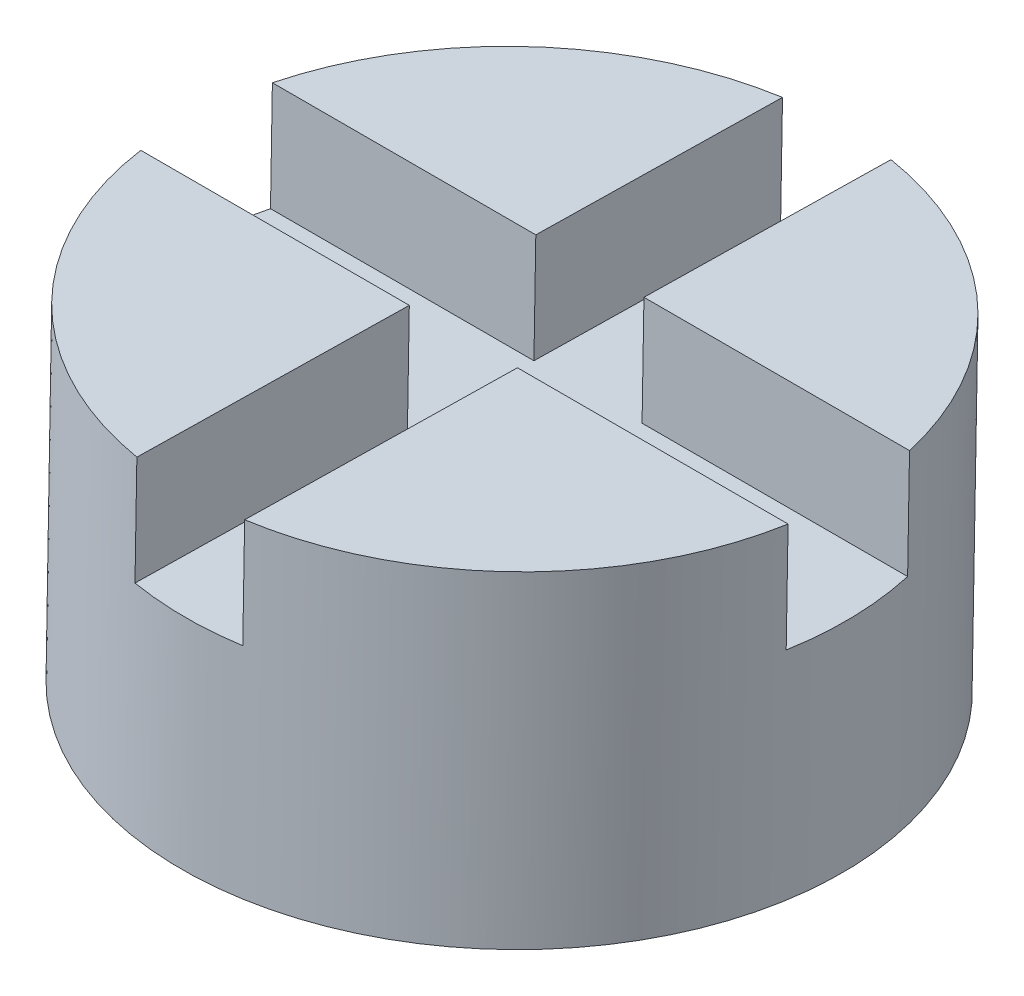
ISO-10303-21;
HEADER;
FILE_DESCRIPTION(('STEP AP214'),'2;1');
FILE_NAME('part.step','',(''),(''),'','','');
FILE_SCHEMA(('AUTOMOTIVE_DESIGN { 1 0 10303 214 1 1 1 1 }'));
ENDSEC;
DATA;
#1=APPLICATION_CONTEXT('core data for automotive mechanical design processes');
#2=APPLICATION_PROTOCOL_DEFINITION('international standard','automotive_design',2000,#1);
#3=PRODUCT_CONTEXT('',#1,'mechanical');
#4=PRODUCT('Part','Part','',(#3));
#5=PRODUCT_RELATED_PRODUCT_CATEGORY('part','',(#4));
#6=PRODUCT_DEFINITION_FORMATION('','',#4);
#7=PRODUCT_DEFINITION_CONTEXT('part definition',#1,'design');
#8=PRODUCT_DEFINITION('design','',#6,#7);
#9=PRODUCT_DEFINITION_SHAPE('','',#8);
#10=(LENGTH_UNIT() NAMED_UNIT(*) SI_UNIT(.MILLI.,.METRE.));
#11=(NAMED_UNIT(*) PLANE_ANGLE_UNIT() SI_UNIT($,.RADIAN.));
#12=(NAMED_UNIT(*) SI_UNIT($,.STERADIAN.) SOLID_ANGLE_UNIT());
#13=UNCERTAINTY_MEASURE_WITH_UNIT(LENGTH_MEASURE(1.E-05),#10,'distance_accuracy_value','');
#14=(GEOMETRIC_REPRESENTATION_CONTEXT(3) GLOBAL_UNCERTAINTY_ASSIGNED_CONTEXT((#13)) GLOBAL_UNIT_ASSIGNED_CONTEXT((#10,
#11,#12)) REPRESENTATION_CONTEXT('',''));
#15=CARTESIAN_POINT('',(0.,0.,0.));
#16=DIRECTION('',(0.,0.,1.));
#17=DIRECTION('',(1.,0.,0.));
#18=AXIS2_PLACEMENT_3D('',#15,#16,#17);
#19=CARTESIAN_POINT('',(0.,42.7310366721,-0.7458730195362));
#20=DIRECTION('',(0.,0.999847695156402,-0.01745240643669));
#21=DIRECTION('',(0.,0.01745240643669,0.999847695156402));
#22=AXIS2_PLACEMENT_3D('',#19,#20,#21);
#23=PLANE('',#22);
#24=DIRECTION('',(1.,0.,0.));
#25=VECTOR('',#24,1.);
#26=CARTESIAN_POINT('',(9.600000000002,42.50671712311,-13.5971313751127));
#27=LINE('',#26,#25);
#28=CARTESIAN_POINT('',(9.600000000002,42.50671712311,-13.5971313751109));
#29=VERTEX_POINT('',#28);
#30=CARTESIAN_POINT('',(7.16387093334177,42.5067171231059,-13.5971313751127));
#31=VERTEX_POINT('',#30);
#32=EDGE_CURVE('E110',#29,#31,#27,.F.);
#33=ORIENTED_EDGE('',*,*,#32,.T.);
#34=CARTESIAN_POINT('',(10.10989056986,42.5190047103629,-12.8931759725434));
#35=DIRECTION('',(0.,-0.999847695156402,0.01745240643669));
#36=DIRECTION('',(0.,-0.01745240643669,-0.999847695156402));
#37=AXIS2_PLACEMENT_3D('',#34,#35,#36);
#38=CIRCLE('',#37,3.02898264973);
#39=CARTESIAN_POINT('',(7.11696841276793,42.52713747285,-12.4272503216927));
#40=VERTEX_POINT('',#39);
#41=EDGE_CURVE('E119',#31,#40,#38,.F.);
#42=ORIENTED_EDGE('',*,*,#41,.T.);
#43=DIRECTION('',(1.,0.,0.));
#44=VECTOR('',#43,1.);
#45=CARTESIAN_POINT('',(6.931831050408,42.52713747285,-12.4272503216927));
#46=LINE('',#45,#44);
#47=CARTESIAN_POINT('',(9.600000000002,42.52713747285,-12.4272503216927));
#48=VERTEX_POINT('',#47);
#49=EDGE_CURVE('E199',#40,#48,#46,.T.);
#50=ORIENTED_EDGE('',*,*,#49,.T.);
#51=DIRECTION('',(0.,0.0174524064357409,0.999847695156418));
#52=VECTOR('',#51,1.);
#53=CARTESIAN_POINT('',(9.600000000002,42.52713747285,-12.42725032169));
#54=LINE('',#53,#52);
#55=CARTESIAN_POINT('',(9.600000000002,42.5711133627535,-9.90787327641806));
#56=VERTEX_POINT('',#55);
#57=EDGE_CURVE('E162',#48,#56,#54,.T.);
#58=ORIENTED_EDGE('',*,*,#57,.T.);
#59=CARTESIAN_POINT('',(10.10989056986,42.5190047103675,-12.8931759725435));
#60=DIRECTION('',(0.,-0.999847695156402,0.01745240643669));
#61=DIRECTION('',(0.,-0.01745240643669,-0.999847695156402));
#62=AXIS2_PLACEMENT_3D('',#59,#60,#61);
#63=CIRCLE('',#62,3.02898264973);
#64=CARTESIAN_POINT('',(10.6,42.5711711432727,-9.90456303304506));
#65=VERTEX_POINT('',#64);
#66=EDGE_CURVE('E19',#56,#65,#63,.F.);
#67=ORIENTED_EDGE('',*,*,#66,.T.);
#68=DIRECTION('',(0.,-0.0174524064385083,-0.99984769515637));
#69=VECTOR('',#68,1.);
#70=CARTESIAN_POINT('',(10.6,42.57117114327,-9.904563033044));
#71=LINE('',#70,#69);
#72=CARTESIAN_POINT('',(10.6,42.52713747285,-12.4272503216909));
#73=VERTEX_POINT('',#72);
#74=EDGE_CURVE('E159',#65,#73,#71,.T.);
#75=ORIENTED_EDGE('',*,*,#74,.T.);
#76=DIRECTION('',(1.,0.,0.));
#77=VECTOR('',#76,1.);
#78=CARTESIAN_POINT('',(10.6,42.52713747285,-12.4272503216927));
#79=LINE('',#78,#77);
#80=CARTESIAN_POINT('',(13.1028127269566,42.5271374728485,-12.4272503216927));
#81=VERTEX_POINT('',#80);
#82=EDGE_CURVE('E92',#73,#81,#79,.T.);
#83=ORIENTED_EDGE('',*,*,#82,.T.);
#84=CARTESIAN_POINT('',(10.10989056986,42.519004710368,-12.8931759725435));
#85=DIRECTION('',(0.,-0.999847695156402,0.01745240643669));
#86=DIRECTION('',(0.,-0.01745240643669,-0.999847695156402));
#87=AXIS2_PLACEMENT_3D('',#84,#85,#86);
#88=CIRCLE('',#87,3.02898264973);
#89=CARTESIAN_POINT('',(13.0559102063797,42.50671712311,-13.5971313751127));
#90=VERTEX_POINT('',#89);
#91=EDGE_CURVE('E153',#81,#90,#88,.F.);
#92=ORIENTED_EDGE('',*,*,#91,.T.);
#93=DIRECTION('',(1.,0.,0.));
#94=VECTOR('',#93,1.);
#95=CARTESIAN_POINT('',(13.22465573615,42.50671712311,-13.5971313751127));
#96=LINE('',#95,#94);
#97=CARTESIAN_POINT('',(10.6,42.50671712311,-13.5971313751128));
#98=VERTEX_POINT('',#97);
#99=EDGE_CURVE('E185',#90,#98,#96,.F.);
#100=ORIENTED_EDGE('',*,*,#99,.T.);
#101=DIRECTION('',(0.,-0.0174524064390977,-0.99984769515636));
#102=VECTOR('',#101,1.);
#103=CARTESIAN_POINT('',(10.6,42.50671712311,-13.59713137511));
#104=LINE('',#103,#102);
#105=CARTESIAN_POINT('',(10.6,42.4668382774548,-15.8817889120403));
#106=VERTEX_POINT('',#105);
#107=EDGE_CURVE('E128',#98,#106,#104,.T.);
#108=ORIENTED_EDGE('',*,*,#107,.T.);
#109=CARTESIAN_POINT('',(10.10989056986,42.5190047103593,-12.8931759725433));
#110=DIRECTION('',(0.,-0.999847695156402,0.01745240643669));
#111=DIRECTION('',(0.,-0.01745240643669,-0.999847695156402));
#112=AXIS2_PLACEMENT_3D('',#109,#110,#111);
#113=CIRCLE('',#112,3.02898264973);
#114=CARTESIAN_POINT('',(9.600000000002,42.4668960579643,-15.8784786686632));
#115=VERTEX_POINT('',#114);
#116=EDGE_CURVE('E131',#106,#115,#113,.F.);
#117=ORIENTED_EDGE('',*,*,#116,.T.);
#118=DIRECTION('',(0.,0.0174524064404693,0.999847695156336));
#119=VECTOR('',#118,1.);
#120=CARTESIAN_POINT('',(9.600000000002,42.46689605797,-15.87847866866));
#121=LINE('',#120,#119);
#122=EDGE_CURVE('E124',#115,#29,#121,.T.);
#123=ORIENTED_EDGE('',*,*,#122,.T.);
#124=EDGE_LOOP('',(#33,#42,#50,#58,#67,#75,#83,#92,#100,#108,#117,#123));
#125=FACE_BOUND('',#124,.T.);
#126=ADVANCED_FACE('F16',(#125),#23,.T.);
#127=CARTESIAN_POINT('',(9.600000000002,44.11172719173,-13.62514693007));
#128=DIRECTION('',(0.,-0.01745240643669,-0.999847695156402));
#129=DIRECTION('',(0.,0.999847695156402,-0.01745240643669));
#130=AXIS2_PLACEMENT_3D('',#127,#128,#129);
#131=PLANE('',#130);
#132=ORIENTED_EDGE('',*,*,#32,.F.);
#133=DIRECTION('',(0.,0.999847695156342,-0.0174524064401115));
#134=VECTOR('',#133,1.);
#135=CARTESIAN_POINT('',(9.600000000002,42.50671712311,-13.59713137511));
#136=LINE('',#135,#134);
#137=CARTESIAN_POINT('',(9.600000000002,43.5065648182617,-13.61458378155));
#138=VERTEX_POINT('',#137);
#139=EDGE_CURVE('E114',#29,#138,#136,.T.);
#140=ORIENTED_EDGE('',*,*,#139,.T.);
#141=DIRECTION('',(1.,0.,0.));
#142=VECTOR('',#141,1.);
#143=CARTESIAN_POINT('',(0.,43.5065648182617,-13.61458378155));
#144=LINE('',#143,#142);
#145=CARTESIAN_POINT('',(7.16387093334185,43.5065648182609,-13.6145837815498));
#146=VERTEX_POINT('',#145);
#147=EDGE_CURVE('E240',#146,#138,#144,.T.);
#148=ORIENTED_EDGE('',*,*,#147,.F.);
#149=DIRECTION('',(0.,0.999847695156402,-0.01745240643669));
#150=VECTOR('',#149,1.);
#151=CARTESIAN_POINT('',(7.163870933343,44.11172719173,-13.62514693007));
#152=LINE('',#151,#150);
#153=EDGE_CURVE('E116',#31,#146,#152,.T.);
#154=ORIENTED_EDGE('',*,*,#153,.F.);
#155=EDGE_LOOP('',(#132,#140,#148,#154));
#156=FACE_BOUND('',#155,.T.);
#157=ADVANCED_FACE('F112',(#156),#131,.F.);
#158=CARTESIAN_POINT('',(9.600000000002,44.069158503,-16.06390547437));
#159=DIRECTION('',(-1.,0.,0.));
#160=DIRECTION('',(0.,0.,1.));
#161=AXIS2_PLACEMENT_3D('',#158,#159,#160);
#162=PLANE('',#161);
#163=ORIENTED_EDGE('',*,*,#122,.F.);
#164=DIRECTION('',(0.,-0.999847695156345,0.0174524064399371));
#165=VECTOR('',#164,1.);
#166=CARTESIAN_POINT('',(9.600000000002,43.46674375313,-15.8959310751));
#167=LINE('',#166,#165);
#168=CARTESIAN_POINT('',(9.600000000002,43.4667437531295,-15.8959310751017));
#169=VERTEX_POINT('',#168);
#170=EDGE_CURVE('E132',#169,#115,#167,.T.);
#171=ORIENTED_EDGE('',*,*,#170,.F.);
#172=DIRECTION('',(0.,0.01745240643669,0.999847695156402));
#173=VECTOR('',#172,1.);
#174=CARTESIAN_POINT('',(9.600000000002,43.73088436726,-0.7633254259729));
#175=LINE('',#174,#173);
#176=EDGE_CURVE('E127',#138,#169,#175,.F.);
#177=ORIENTED_EDGE('',*,*,#176,.F.);
#178=ORIENTED_EDGE('',*,*,#139,.F.);
#179=EDGE_LOOP('',(#163,#171,#177,#178));
#180=FACE_BOUND('',#179,.T.);
#181=ADVANCED_FACE('F123',(#180),#162,.F.);
#182=CARTESIAN_POINT('',(10.6,44.11172719173,-13.62514693007));
#183=DIRECTION('',(1.,0.,0.));
#184=DIRECTION('',(0.,0.,-1.));
#185=AXIS2_PLACEMENT_3D('',#182,#183,#184);
#186=PLANE('',#185);
#187=ORIENTED_EDGE('',*,*,#107,.F.);
#188=DIRECTION('',(0.,0.999847695156402,-0.01745240643669));
#189=VECTOR('',#188,1.);
#190=CARTESIAN_POINT('',(10.6,44.11172719173,-13.62514693007));
#191=LINE('',#190,#189);
#192=CARTESIAN_POINT('',(10.6,43.5065648182617,-13.6145837815498));
#193=VERTEX_POINT('',#192);
#194=EDGE_CURVE('E187',#98,#193,#191,.T.);
#195=ORIENTED_EDGE('',*,*,#194,.T.);
#196=DIRECTION('',(0.,0.01745240643669,0.999847695156402));
#197=VECTOR('',#196,1.);
#198=CARTESIAN_POINT('',(10.6,43.73088436726,-0.7633254259729));
#199=LINE('',#198,#197);
#200=CARTESIAN_POINT('',(10.6,43.4666859726186,-15.8992413184788));
#201=VERTEX_POINT('',#200);
#202=EDGE_CURVE('E224',#201,#193,#199,.T.);
#203=ORIENTED_EDGE('',*,*,#202,.F.);
#204=DIRECTION('',(0.,0.999847695156345,-0.0174524064399371));
#205=VECTOR('',#204,1.);
#206=CARTESIAN_POINT('',(10.6,42.46683827746,-15.88178891204));
#207=LINE('',#206,#205);
#208=EDGE_CURVE('E186',#106,#201,#207,.T.);
#209=ORIENTED_EDGE('',*,*,#208,.F.);
#210=EDGE_LOOP('',(#187,#195,#203,#209));
#211=FACE_BOUND('',#210,.T.);
#212=ADVANCED_FACE('F280',(#211),#186,.F.);
#213=CARTESIAN_POINT('',(13.22465573615,44.11172719173,-13.62514693007));
#214=DIRECTION('',(0.,-0.01745240643669,-0.999847695156402));
#215=DIRECTION('',(0.,0.999847695156402,-0.01745240643669));
#216=AXIS2_PLACEMENT_3D('',#213,#214,#215);
#217=PLANE('',#216);
#218=ORIENTED_EDGE('',*,*,#99,.F.);
#219=DIRECTION('',(0.,0.999847695156402,-0.01745240643669));
#220=VECTOR('',#219,1.);
#221=CARTESIAN_POINT('',(13.05591020638,44.11172719173,-13.62514693007));
#222=LINE('',#221,#220);
#223=CARTESIAN_POINT('',(13.0559102063797,43.5065648182631,-13.6145837815499));
#224=VERTEX_POINT('',#223);
#225=EDGE_CURVE('E182',#224,#90,#222,.F.);
#226=ORIENTED_EDGE('',*,*,#225,.F.);
#227=DIRECTION('',(1.,0.,0.));
#228=VECTOR('',#227,1.);
#229=CARTESIAN_POINT('',(0.,43.5065648182617,-13.61458378155));
#230=LINE('',#229,#228);
#231=EDGE_CURVE('E225',#193,#224,#230,.T.);
#232=ORIENTED_EDGE('',*,*,#231,.F.);
#233=ORIENTED_EDGE('',*,*,#194,.F.);
#234=EDGE_LOOP('',(#218,#226,#232,#233));
#235=FACE_BOUND('',#234,.T.);
#236=ADVANCED_FACE('F216',(#235),#217,.F.);
#237=CARTESIAN_POINT('',(10.6,44.13214754147,-12.45526587665));
#238=DIRECTION('',(0.,0.01745240643669,0.999847695156402));
#239=DIRECTION('',(0.,-0.999847695156402,0.01745240643669));
#240=AXIS2_PLACEMENT_3D('',#237,#238,#239);
#241=PLANE('',#240);
#242=ORIENTED_EDGE('',*,*,#82,.F.);
#243=DIRECTION('',(0.,0.999847695156345,-0.0174524064399371));
#244=VECTOR('',#243,1.);
#245=CARTESIAN_POINT('',(10.6,42.52713747285,-12.42725032169));
#246=LINE('',#245,#244);
#247=CARTESIAN_POINT('',(10.6,43.5269851680068,-12.4447027281299));
#248=VERTEX_POINT('',#247);
#249=EDGE_CURVE('E168',#73,#248,#246,.T.);
#250=ORIENTED_EDGE('',*,*,#249,.T.);
#251=DIRECTION('',(1.,0.,0.));
#252=VECTOR('',#251,1.);
#253=CARTESIAN_POINT('',(0.,43.5269851680068,-12.4447027281299));
#254=LINE('',#253,#252);
#255=CARTESIAN_POINT('',(13.1028127269566,43.5269851680084,-12.4447027281298));
#256=VERTEX_POINT('',#255);
#257=EDGE_CURVE('E226',#256,#248,#254,.F.);
#258=ORIENTED_EDGE('',*,*,#257,.F.);
#259=DIRECTION('',(0.,-0.999847695156402,0.01745240643669));
#260=VECTOR('',#259,1.);
#261=CARTESIAN_POINT('',(13.10281272696,44.13214754147,-12.45526587665));
#262=LINE('',#261,#260);
#263=EDGE_CURVE('E172',#81,#256,#262,.F.);
#264=ORIENTED_EDGE('',*,*,#263,.F.);
#265=EDGE_LOOP('',(#242,#250,#258,#264));
#266=FACE_BOUND('',#265,.T.);
#267=ADVANCED_FACE('F271',(#266),#241,.F.);
#268=CARTESIAN_POINT('',(10.6,44.17898343705,-9.772039216306));
#269=DIRECTION('',(1.,0.,0.));
#270=DIRECTION('',(0.,0.,-1.));
#271=AXIS2_PLACEMENT_3D('',#268,#269,#270);
#272=PLANE('',#271);
#273=ORIENTED_EDGE('',*,*,#74,.F.);
#274=DIRECTION('',(0.,-0.999847695156394,0.0174524064371096));
#275=VECTOR('',#274,1.);
#276=CARTESIAN_POINT('',(10.6,43.57101883842,-9.922015439481));
#277=LINE('',#276,#275);
#278=CARTESIAN_POINT('',(10.6,43.5710188384238,-9.92201543948187));
#279=VERTEX_POINT('',#278);
#280=EDGE_CURVE('E166',#279,#65,#277,.T.);
#281=ORIENTED_EDGE('',*,*,#280,.F.);
#282=DIRECTION('',(0.,0.01745240643669,0.999847695156402));
#283=VECTOR('',#282,1.);
#284=CARTESIAN_POINT('',(10.6,43.73088436726,-0.7633254259729));
#285=LINE('',#284,#283);
#286=EDGE_CURVE('E229',#248,#279,#285,.T.);
#287=ORIENTED_EDGE('',*,*,#286,.F.);
#288=ORIENTED_EDGE('',*,*,#249,.F.);
#289=EDGE_LOOP('',(#273,#281,#287,#288));
#290=FACE_BOUND('',#289,.T.);
#291=ADVANCED_FACE('F164',(#290),#272,.F.);
#292=CARTESIAN_POINT('',(9.600000000002,44.13214754147,-12.45526587665));
#293=DIRECTION('',(-1.,0.,0.));
#294=DIRECTION('',(0.,0.,1.));
#295=AXIS2_PLACEMENT_3D('',#292,#293,#294);
#296=PLANE('',#295);
#297=ORIENTED_EDGE('',*,*,#57,.F.);
#298=DIRECTION('',(0.,-0.999847695156402,0.01745240643669));
#299=VECTOR('',#298,1.);
#300=CARTESIAN_POINT('',(9.600000000002,44.13214754147,-12.45526587665));
#301=LINE('',#300,#299);
#302=CARTESIAN_POINT('',(9.600000000002,43.5269851680068,-12.4447027281298));
#303=VERTEX_POINT('',#302);
#304=EDGE_CURVE('E201',#48,#303,#301,.F.);
#305=ORIENTED_EDGE('',*,*,#304,.T.);
#306=DIRECTION('',(0.,0.01745240643669,0.999847695156402));
#307=VECTOR('',#306,1.);
#308=CARTESIAN_POINT('',(9.600000000002,43.73088436726,-0.7633254259729));
#309=LINE('',#308,#307);
#310=CARTESIAN_POINT('',(9.600000000002,43.5709610579096,-9.92532568285586));
#311=VERTEX_POINT('',#310);
#312=EDGE_CURVE('E254',#311,#303,#309,.F.);
#313=ORIENTED_EDGE('',*,*,#312,.F.);
#314=DIRECTION('',(0.,0.999847695156397,-0.0174524064369368));
#315=VECTOR('',#314,1.);
#316=CARTESIAN_POINT('',(9.600000000002,42.57111336275,-9.907873276418));
#317=LINE('',#316,#315);
#318=EDGE_CURVE('E177',#56,#311,#317,.T.);
#319=ORIENTED_EDGE('',*,*,#318,.F.);
#320=EDGE_LOOP('',(#297,#305,#313,#319));
#321=FACE_BOUND('',#320,.T.);
#322=ADVANCED_FACE('F252',(#321),#296,.F.);
#323=CARTESIAN_POINT('',(6.931831050408,44.13214754147,-12.45526587665));
#324=DIRECTION('',(0.,0.01745240643669,0.999847695156402));
#325=DIRECTION('',(0.,-0.999847695156402,0.01745240643669));
#326=AXIS2_PLACEMENT_3D('',#323,#324,#325);
#327=PLANE('',#326);
#328=ORIENTED_EDGE('',*,*,#49,.F.);
#329=DIRECTION('',(0.,-0.999847695156402,0.01745240643669));
#330=VECTOR('',#329,1.);
#331=CARTESIAN_POINT('',(7.116968412769,44.13214754147,-12.45526587665));
#332=LINE('',#331,#330);
#333=CARTESIAN_POINT('',(7.11696841276789,43.5269851680072,-12.4447027281298));
#334=VERTEX_POINT('',#333);
#335=EDGE_CURVE('E34',#334,#40,#332,.T.);
#336=ORIENTED_EDGE('',*,*,#335,.F.);
#337=DIRECTION('',(1.,0.,0.));
#338=VECTOR('',#337,1.);
#339=CARTESIAN_POINT('',(0.,43.5269851680068,-12.4447027281299));
#340=LINE('',#339,#338);
#341=EDGE_CURVE('E151',#303,#334,#340,.F.);
#342=ORIENTED_EDGE('',*,*,#341,.F.);
#343=ORIENTED_EDGE('',*,*,#304,.F.);
#344=EDGE_LOOP('',(#328,#336,#342,#343));
#345=FACE_BOUND('',#344,.T.);
#346=ADVANCED_FACE('F257',(#345),#327,.F.);
#347=CARTESIAN_POINT('',(0.,43.73088436726,-0.7633254259729));
#348=DIRECTION('',(0.,0.999847695156402,-0.01745240643669));
#349=DIRECTION('',(0.,0.01745240643669,0.999847695156402));
#350=AXIS2_PLACEMENT_3D('',#347,#348,#349);
#351=PLANE('',#350);
#352=ORIENTED_EDGE('',*,*,#147,.T.);
#353=ORIENTED_EDGE('',*,*,#176,.T.);
#354=CARTESIAN_POINT('',(10.10989056986,43.518852405518,-12.9106283789801));
#355=DIRECTION('',(0.,-0.999847695156402,0.01745240643669));
#356=DIRECTION('',(0.,-0.01745240643669,-0.999847695156402));
#357=AXIS2_PLACEMENT_3D('',#354,#355,#356);
#358=CIRCLE('',#357,3.02898264973);
#359=EDGE_CURVE('E148',#146,#169,#358,.T.);
#360=ORIENTED_EDGE('',*,*,#359,.F.);
#361=EDGE_LOOP('',(#352,#353,#360));
#362=FACE_BOUND('',#361,.T.);
#363=ADVANCED_FACE('F300',(#362),#351,.T.);
#364=CARTESIAN_POINT('',(0.,43.73088436726,-0.7633254259729));
#365=DIRECTION('',(0.,0.999847695156402,-0.01745240643669));
#366=DIRECTION('',(0.,0.01745240643669,0.999847695156402));
#367=AXIS2_PLACEMENT_3D('',#364,#365,#366);
#368=PLANE('',#367);
#369=ORIENTED_EDGE('',*,*,#202,.T.);
#370=ORIENTED_EDGE('',*,*,#231,.T.);
#371=CARTESIAN_POINT('',(10.10989056986,43.5188524055225,-12.9106283789801));
#372=DIRECTION('',(0.,-0.999847695156402,0.01745240643669));
#373=DIRECTION('',(0.,-0.01745240643669,-0.999847695156402));
#374=AXIS2_PLACEMENT_3D('',#371,#372,#373);
#375=CIRCLE('',#374,3.02898264973);
#376=EDGE_CURVE('E145',#201,#224,#375,.T.);
#377=ORIENTED_EDGE('',*,*,#376,.F.);
#378=EDGE_LOOP('',(#369,#370,#377));
#379=FACE_BOUND('',#378,.T.);
#380=ADVANCED_FACE('F223',(#379),#368,.T.);
#381=CARTESIAN_POINT('',(0.,43.73088436726,-0.7633254259729));
#382=DIRECTION('',(0.,0.999847695156402,-0.01745240643669));
#383=DIRECTION('',(0.,0.01745240643669,0.999847695156402));
#384=AXIS2_PLACEMENT_3D('',#381,#382,#383);
#385=PLANE('',#384);
#386=ORIENTED_EDGE('',*,*,#257,.T.);
#387=ORIENTED_EDGE('',*,*,#286,.T.);
#388=CARTESIAN_POINT('',(10.10989056986,43.518852405523,-12.9106283789801));
#389=DIRECTION('',(0.,-0.999847695156402,0.01745240643669));
#390=DIRECTION('',(0.,-0.01745240643669,-0.999847695156402));
#391=AXIS2_PLACEMENT_3D('',#388,#389,#390);
#392=CIRCLE('',#391,3.02898264973);
#393=EDGE_CURVE('E142',#256,#279,#392,.T.);
#394=ORIENTED_EDGE('',*,*,#393,.F.);
#395=EDGE_LOOP('',(#386,#387,#394));
#396=FACE_BOUND('',#395,.T.);
#397=ADVANCED_FACE('F269',(#396),#385,.T.);
#398=CARTESIAN_POINT('',(0.,43.73088436726,-0.7633254259729));
#399=DIRECTION('',(0.,0.999847695156402,-0.01745240643669));
#400=DIRECTION('',(0.,0.01745240643669,0.999847695156402));
#401=AXIS2_PLACEMENT_3D('',#398,#399,#400);
#402=PLANE('',#401);
#403=ORIENTED_EDGE('',*,*,#312,.T.);
#404=ORIENTED_EDGE('',*,*,#341,.T.);
#405=CARTESIAN_POINT('',(10.10989056986,43.5188524055205,-12.9106283789801));
#406=DIRECTION('',(0.,-0.999847695156402,0.01745240643669));
#407=DIRECTION('',(0.,-0.01745240643669,-0.999847695156402));
#408=AXIS2_PLACEMENT_3D('',#405,#406,#407);
#409=CIRCLE('',#408,3.02898264973);
#410=EDGE_CURVE('E25',#311,#334,#409,.T.);
#411=ORIENTED_EDGE('',*,*,#410,.F.);
#412=EDGE_LOOP('',(#403,#404,#411));
#413=FACE_BOUND('',#412,.T.);
#414=ADVANCED_FACE('F289',(#413),#402,.T.);
#415=CARTESIAN_POINT('',(10.10989056986,40.51930932005,-12.85827115967));
#416=DIRECTION('',(0.,-0.999847695156402,0.01745240643669));
#417=DIRECTION('',(0.,-0.01745240643669,-0.999847695156402));
#418=AXIS2_PLACEMENT_3D('',#415,#416,#417);
#419=CYLINDRICAL_SURFACE('',#418,3.02898264973);
#420=CARTESIAN_POINT('',(10.10989056986,40.51930932005,-12.85827115967));
#421=DIRECTION('',(0.,-0.999847695156402,0.01745240643669));
#422=DIRECTION('',(0.,-0.01745240643669,-0.999847695156402));
#423=AXIS2_PLACEMENT_3D('',#420,#421,#422);
#424=CIRCLE('',#423,3.02898264973);
#425=CARTESIAN_POINT('',(10.10989056986,40.4664462837572,-15.8867924806713));
#426=VERTEX_POINT('',#425);
#427=EDGE_CURVE('E11',#426,#426,#424,.F.);
#428=ORIENTED_EDGE('',*,*,#427,.T.);
#429=EDGE_LOOP('',(#428));
#430=FACE_BOUND('',#429,.T.);
#431=ORIENTED_EDGE('',*,*,#335,.T.);
#432=ORIENTED_EDGE('',*,*,#41,.F.);
#433=ORIENTED_EDGE('',*,*,#153,.T.);
#434=ORIENTED_EDGE('',*,*,#359,.T.);
#435=ORIENTED_EDGE('',*,*,#170,.T.);
#436=ORIENTED_EDGE('',*,*,#116,.F.);
#437=ORIENTED_EDGE('',*,*,#208,.T.);
#438=ORIENTED_EDGE('',*,*,#376,.T.);
#439=ORIENTED_EDGE('',*,*,#225,.T.);
#440=ORIENTED_EDGE('',*,*,#91,.F.);
#441=ORIENTED_EDGE('',*,*,#263,.T.);
#442=ORIENTED_EDGE('',*,*,#393,.T.);
#443=ORIENTED_EDGE('',*,*,#280,.T.);
#444=ORIENTED_EDGE('',*,*,#66,.F.);
#445=ORIENTED_EDGE('',*,*,#318,.T.);
#446=ORIENTED_EDGE('',*,*,#410,.T.);
#447=EDGE_LOOP('',(#431,#432,#433,#434,#435,#436,#437,#438,#439,#440,#441,#442,#443,#444,#445,#446));
#448=FACE_BOUND('',#447,.T.);
#449=ADVANCED_FACE('F170',(#430,#448),#419,.T.);
#450=CARTESIAN_POINT('',(0.,40.73134128179,-0.7109682066629));
#451=DIRECTION('',(0.,0.999847695156402,-0.01745240643669));
#452=DIRECTION('',(0.,0.01745240643669,0.999847695156402));
#453=AXIS2_PLACEMENT_3D('',#450,#451,#452);
#454=PLANE('',#453);
#455=ORIENTED_EDGE('',*,*,#427,.F.);
#456=EDGE_LOOP('',(#455));
#457=FACE_BOUND('',#456,.T.);
#458=ADVANCED_FACE('F282',(#457),#454,.F.);
#459=CLOSED_SHELL('',(#126,#157,#181,#212,#236,#267,#291,#322,#346,#363,#380,#397,#414,#449,#458));
#460=MANIFOLD_SOLID_BREP('B1',#459);
#461=ADVANCED_BREP_SHAPE_REPRESENTATION('',(#18,#460),#14);
#462=SHAPE_DEFINITION_REPRESENTATION(#9,#461);
ENDSEC;
END-ISO-10303-21;
